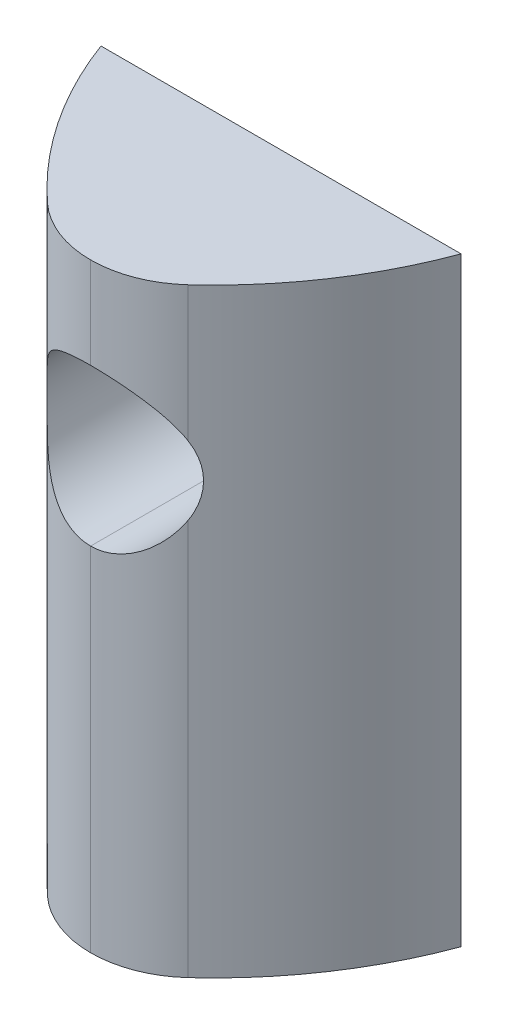
ISO-10303-21;
HEADER;
FILE_DESCRIPTION(('STEP AP214'),'2;1');
FILE_NAME('part.step','',(''),(''),'','','');
FILE_SCHEMA(('AUTOMOTIVE_DESIGN { 1 0 10303 214 1 1 1 1 }'));
ENDSEC;
DATA;
#1=APPLICATION_CONTEXT('core data for automotive mechanical design processes');
#2=APPLICATION_PROTOCOL_DEFINITION('international standard','automotive_design',2000,#1);
#3=PRODUCT_CONTEXT('',#1,'mechanical');
#4=PRODUCT('Part','Part','',(#3));
#5=PRODUCT_RELATED_PRODUCT_CATEGORY('part','',(#4));
#6=PRODUCT_DEFINITION_FORMATION('','',#4);
#7=PRODUCT_DEFINITION_CONTEXT('part definition',#1,'design');
#8=PRODUCT_DEFINITION('design','',#6,#7);
#9=PRODUCT_DEFINITION_SHAPE('','',#8);
#10=(LENGTH_UNIT() NAMED_UNIT(*) SI_UNIT(.MILLI.,.METRE.));
#11=(NAMED_UNIT(*) PLANE_ANGLE_UNIT() SI_UNIT($,.RADIAN.));
#12=(NAMED_UNIT(*) SI_UNIT($,.STERADIAN.) SOLID_ANGLE_UNIT());
#13=UNCERTAINTY_MEASURE_WITH_UNIT(LENGTH_MEASURE(1.E-05),#10,'distance_accuracy_value','');
#14=(GEOMETRIC_REPRESENTATION_CONTEXT(3) GLOBAL_UNCERTAINTY_ASSIGNED_CONTEXT((#13)) GLOBAL_UNIT_ASSIGNED_CONTEXT((#10,
#11,#12)) REPRESENTATION_CONTEXT('',''));
#15=CARTESIAN_POINT('',(0.,0.,0.));
#16=DIRECTION('',(0.,0.,1.));
#17=DIRECTION('',(1.,0.,0.));
#18=AXIS2_PLACEMENT_3D('',#15,#16,#17);
#19=CARTESIAN_POINT('',(0.,0.,3.7));
#20=DIRECTION('',(0.,0.,-1.));
#21=DIRECTION('',(0.,1.,0.));
#22=AXIS2_PLACEMENT_3D('',#19,#20,#21);
#23=CYLINDRICAL_SURFACE('',#22,3.);
#24=DIRECTION('',(0.,0.,1.));
#25=VECTOR('',#24,1.);
#26=CARTESIAN_POINT('',(0.,3.,3.7));
#27=LINE('',#26,#25);
#28=CARTESIAN_POINT('',(0.,3.,0.));
#29=VERTEX_POINT('',#28);
#30=CARTESIAN_POINT('',(0.,3.,7.29999999870545));
#31=VERTEX_POINT('',#30);
#32=EDGE_CURVE('E11',#29,#31,#27,.T.);
#33=ORIENTED_EDGE('',*,*,#32,.F.);
#34=CARTESIAN_POINT('',(0.,0.,-2.10524930821521E-11));
#35=DIRECTION('',(-3.05108595396026E-12,0.,1.));
#36=DIRECTION('',(0.,1.,0.));
#37=AXIS2_PLACEMENT_3D('',#34,#35,#36);
#38=CIRCLE('',#37,3.);
#39=CARTESIAN_POINT('',(0.,-3.,-2.10519420093098E-11));
#40=VERTEX_POINT('',#39);
#41=EDGE_CURVE('E42',#40,#29,#38,.T.);
#42=ORIENTED_EDGE('',*,*,#41,.F.);
#43=DIRECTION('',(0.,0.,-1.));
#44=VECTOR('',#43,1.);
#45=CARTESIAN_POINT('',(0.,-3.,3.7));
#46=LINE('',#45,#44);
#47=CARTESIAN_POINT('',(0.,-3.,7.29999999870545));
#48=VERTEX_POINT('',#47);
#49=EDGE_CURVE('E30',#48,#40,#46,.T.);
#50=ORIENTED_EDGE('',*,*,#49,.F.);
#51=CARTESIAN_POINT('',(2.69192007274975,-1.3242115114795,6.25864264698223));
#52=CARTESIAN_POINT('',(2.67720784347117,-1.35411814201266,6.27202872146754));
#53=CARTESIAN_POINT('',(2.66204738401228,-1.38371102472413,6.2856217327122));
#54=CARTESIAN_POINT('',(2.63072995354465,-1.4424524896421,6.31325383137786));
#55=CARTESIAN_POINT('',(2.61456696080966,-1.47159673937573,6.32729530584371));
#56=CARTESIAN_POINT('',(2.58121584383853,-1.52944089722613,6.35578294758398));
#57=CARTESIAN_POINT('',(2.56402083838565,-1.55813571784571,6.37023138531682));
#58=CARTESIAN_POINT('',(2.52857750693921,-1.61508197796633,6.39948838888067));
#59=CARTESIAN_POINT('',(2.51032147940027,-1.64332758694842,6.41429897049374));
#60=CARTESIAN_POINT('',(2.47272760723834,-1.69937608156812,6.44423295088127));
#61=CARTESIAN_POINT('',(2.45338128004321,-1.72717240608493,6.45935797792016));
#62=CARTESIAN_POINT('',(2.41357854042755,-1.78232314634219,6.48987048938291));
#63=CARTESIAN_POINT('',(2.39311291301674,-1.80967029581839,6.50525908310341));
#64=CARTESIAN_POINT('',(2.35104331285052,-1.86392307093589,6.53624553490519));
#65=CARTESIAN_POINT('',(2.32942944271734,-1.89082075262991,6.55184385981726));
#66=CARTESIAN_POINT('',(2.28503673569903,-1.94417640487641,6.58319263156358));
#67=CARTESIAN_POINT('',(2.26224738982099,-1.97062580846311,6.59894277406409));
#68=CARTESIAN_POINT('',(2.21665326612155,-2.02175832423984,6.62974110956908));
#69=CARTESIAN_POINT('',(2.19388315521676,-2.04647018860848,6.64479289710127));
#70=CARTESIAN_POINT('',(2.14759859995315,-2.09504694182213,6.6746963802095));
#71=CARTESIAN_POINT('',(2.12408815404397,-2.11891526370066,6.68954868354567));
#72=CARTESIAN_POINT('',(2.07631756229429,-2.16580635842281,6.71901884499676));
#73=CARTESIAN_POINT('',(2.05206080485596,-2.18883214093944,6.73363740490861));
#74=CARTESIAN_POINT('',(2.00279206668965,-2.23403831623137,6.7626056417903));
#75=CARTESIAN_POINT('',(1.97778285542022,-2.25622125793177,6.77695604933474));
#76=CARTESIAN_POINT('',(1.92700504877662,-2.29974227738643,6.80535240766267));
#77=CARTESIAN_POINT('',(1.90123859640987,-2.32108240145828,6.81939905290779));
#78=CARTESIAN_POINT('',(1.84894327614461,-2.36291835724841,6.84715144116665));
#79=CARTESIAN_POINT('',(1.822415926535,-2.38341569536674,6.86085777337675));
#80=CARTESIAN_POINT('',(1.76859674023019,-2.42356634157081,6.88789232629755));
#81=CARTESIAN_POINT('',(1.74130580744956,-2.44322058320613,6.90122095936972));
#82=CARTESIAN_POINT('',(1.68595966251818,-2.48168670373533,6.9274615870955));
#83=CARTESIAN_POINT('',(1.65790475769919,-2.50049891354092,6.94037374485316));
#84=CARTESIAN_POINT('',(1.59929539626329,-2.53839820200053,6.96651689145242));
#85=CARTESIAN_POINT('',(1.56869313808505,-2.55743144111336,6.97971890565638));
#86=CARTESIAN_POINT('',(1.50695487761382,-2.59430206778622,7.00542763013001));
#87=CARTESIAN_POINT('',(1.47582717284138,-2.61214943897421,7.01793993535377));
#88=CARTESIAN_POINT('',(1.4130531431408,-2.64665016409749,7.042245757588));
#89=CARTESIAN_POINT('',(1.38141411310399,-2.6633129038567,7.05404477841465));
#90=CARTESIAN_POINT('',(1.31763277696531,-2.69544464378142,7.07690110657756));
#91=CARTESIAN_POINT('',(1.28549675970014,-2.71092234328351,7.08796372110337));
#92=CARTESIAN_POINT('',(1.22073792899109,-2.74068478710282,7.10932445999845));
#93=CARTESIAN_POINT('',(1.18812040331353,-2.75497743703643,7.11962758924341));
#94=CARTESIAN_POINT('',(1.12241598258701,-2.78237069721538,7.13944687285696));
#95=CARTESIAN_POINT('',(1.08933339906701,-2.79547831866537,7.14896762079916));
#96=CARTESIAN_POINT('',(1.02271705299583,-2.82050203423022,7.1672000083506));
#97=CARTESIAN_POINT('',(0.989186670396409,-2.83242415292945,7.17591572105779));
#98=CARTESIAN_POINT('',(0.921694541300396,-2.85507943439018,7.19251610111971));
#99=CARTESIAN_POINT('',(0.887735302499064,-2.86581753868522,7.20040421523846));
#100=CARTESIAN_POINT('',(0.818837424648658,-2.88626818737322,7.21545208465926));
#101=CARTESIAN_POINT('',(0.783891770073834,-2.89596525059668,7.22260079913224));
#102=CARTESIAN_POINT('',(0.713767155292945,-2.91405642675939,7.23596254092414));
#103=CARTESIAN_POINT('',(0.678591727130362,-2.92245948226957,7.24218198043198));
#104=CARTESIAN_POINT('',(0.608033524978298,-2.93796547184082,7.25367740705112));
#105=CARTESIAN_POINT('',(0.572653331877364,-2.94507603750542,7.25895892760568));
#106=CARTESIAN_POINT('',(0.50171126452963,-2.95799796945709,7.26857162758206));
#107=CARTESIAN_POINT('',(0.466151141868007,-2.96381555866894,7.27290735701724));
#108=CARTESIAN_POINT('',(0.39487519883373,-2.97415307178424,7.28062227559394));
#109=CARTESIAN_POINT('',(0.359160439642374,-2.97867771225755,7.28400494078442));
#110=CARTESIAN_POINT('',(0.287601327761551,-2.98643093702231,7.28980839923261));
#111=CARTESIAN_POINT('',(0.251757503934948,-2.98966265685079,7.29223151939141));
#112=CARTESIAN_POINT('',(0.179966449669252,-2.99483127535609,7.29611088622426));
#113=CARTESIAN_POINT('',(0.144019388171461,-2.99676967690429,7.29756825511437));
#114=CARTESIAN_POINT('',(0.0720482708555974,-2.99935471704482,7.29951338294089));
#115=CARTESIAN_POINT('',(0.0360242061418717,-3.00000119730495,7.30000102303156));
#116=CARTESIAN_POINT('',(1.32411364248814E-11,-3.,7.29999999870546));
#117=B_SPLINE_CURVE_WITH_KNOTS('',3,(#51,#52,#53,#54,#55,#56,#57,#58,#59,#60,#61,#62,#63,#64,
#65,#66,#67,#68,#69,#70,#71,#72,#73,#74,#75,#76,#77,#78,#79,#80,#81,#82,#83,#84,#85,#86,#87,#88,
#89,#90,#91,#92,#93,#94,#95,#96,#97,#98,#99,#100,#101,#102,#103,#104,#105,#106,#107,#108,#109,
#110,#111,#112,#113,#114,#115,#116),.UNSPECIFIED.,.F.,.F.,(4,2,2,2,2,2,2,2,2,2,2,2,2,2,2,2,2,2,
2,2,2,2,2,2,2,2,2,2,2,2,2,2,4),(0.,0.107746032995566,0.216217450337496,0.32551656349466,
0.435743378021583,0.546995396535927,0.659367451802861,0.772951569937411,0.887836863083225,
0.998280079306827,1.10820454771261,1.2176877439571,1.32680808343825,1.43564476567889,
1.5442776104283,1.65278688708157,1.76125313918145,1.87636829505888,1.99034238448352,
2.10327954469567,2.2152868051699,2.32647388078152,2.43695292995169,2.54683827912412,
2.65624611591389,2.76710421549757,2.87715803272218,2.98653927727008,3.09538210047251,
3.20382265191496,3.3119986000837,3.42004862487691,3.52811189099413),.UNSPECIFIED.);
#118=CARTESIAN_POINT('',(2.69192396008196,-1.32421501016136,6.25863911008959));
#119=VERTEX_POINT('',#118);
#120=EDGE_CURVE('E136',#119,#48,#117,.T.);
#121=ORIENTED_EDGE('',*,*,#120,.F.);
#122=CARTESIAN_POINT('',(2.69185728044747,1.3241549490095,6.25870011171368));
#123=CARTESIAN_POINT('',(2.70443470825341,1.29850610866361,6.24719381640744));
#124=CARTESIAN_POINT('',(2.71670328909421,1.27259407001275,6.23593303728926));
#125=CARTESIAN_POINT('',(2.74043171805568,1.22059860978277,6.21408885536098));
#126=CARTESIAN_POINT('',(2.75190015162282,1.19452205026827,6.20349843576422));
#127=CARTESIAN_POINT('',(2.77403481822859,1.14219740381921,6.18300154664542));
#128=CARTESIAN_POINT('',(2.7847092560312,1.11595548639828,6.17308820755108));
#129=CARTESIAN_POINT('',(2.80526202490549,1.06330106130273,6.15395168362618));
#130=CARTESIAN_POINT('',(2.81514810277422,1.03689399050042,6.144721870321));
#131=CARTESIAN_POINT('',(2.83413003362655,0.983909969453827,6.12695791954373));
#132=CARTESIAN_POINT('',(2.84323309233468,0.957337712213903,6.11841749652379));
#133=CARTESIAN_POINT('',(2.86065432787739,0.904024020516801,6.1020375001179));
#134=CARTESIAN_POINT('',(2.86897908834832,0.877286535257312,6.09419208449227));
#135=CARTESIAN_POINT('',(2.88484958160838,0.82364340897977,6.07920592203263));
#136=CARTESIAN_POINT('',(2.89240118633839,0.796740986061545,6.0720598852911));
#137=CARTESIAN_POINT('',(2.90672787815533,0.742767732942254,6.05847861575652));
#138=CARTESIAN_POINT('',(2.9135080692256,0.71569943111102,6.05203872253978));
#139=CARTESIAN_POINT('',(2.92658668060808,0.660204764319864,6.03959699759912));
#140=CARTESIAN_POINT('',(2.93285694367211,0.631765921292732,6.03362116663946));
#141=CARTESIAN_POINT('',(2.94454939656982,0.574813532259298,6.02246189014066));
#142=CARTESIAN_POINT('',(2.94997815645342,0.546302538328794,6.01727231395095));
#143=CARTESIAN_POINT('',(2.95998951162952,0.489205510366902,6.00769053163653));
#144=CARTESIAN_POINT('',(2.96457764061418,0.460621323462035,6.00329311437882));
#145=CARTESIAN_POINT('',(2.97291231342435,0.403378918774342,5.99529703386324));
#146=CARTESIAN_POINT('',(2.97666324175023,0.374721921612543,5.99169421047989));
#147=CARTESIAN_POINT('',(2.98332683118071,0.317334433688192,5.98528884682715));
#148=CARTESIAN_POINT('',(2.98624265802846,0.288604648469963,5.98248328458559));
#149=CARTESIAN_POINT('',(2.99123921278662,0.231072110382954,5.97767306141957));
#150=CARTESIAN_POINT('',(2.99332182969163,0.202269673260767,5.97566658890309));
#151=CARTESIAN_POINT('',(2.99665431399511,0.144592185220519,5.97245489855647));
#152=CARTESIAN_POINT('',(2.99790475802235,0.115717198528522,5.9712491259071));
#153=CARTESIAN_POINT('',(2.99957587367158,0.0578948851457967,5.96963753354035));
#154=CARTESIAN_POINT('',(2.99999579580762,0.0289475166968562,5.96923243637493));
#155=CARTESIAN_POINT('',(3.00000419827837,-0.0289067957285459,5.96922433162744));
#156=CARTESIAN_POINT('',(2.99959384738556,-0.0578137392882151,5.96962019653383));
#157=CARTESIAN_POINT('',(2.9979383546292,-0.115566754520504,5.97121672935865));
#158=CARTESIAN_POINT('',(2.99669363883272,-0.14441284972724,5.97241698651544));
#159=CARTESIAN_POINT('',(2.99337084174549,-0.202044144277529,5.97561936570399));
#160=CARTESIAN_POINT('',(2.99129184821313,-0.230829242173793,5.97762236549219));
#161=CARTESIAN_POINT('',(2.98630031777555,-0.288338706386949,5.98242779799937));
#162=CARTESIAN_POINT('',(2.98338554941799,-0.317062699925251,5.98523237078872));
#163=CARTESIAN_POINT('',(2.97672196888944,-0.374450226312713,5.99163779188604));
#164=CARTESIAN_POINT('',(2.97296964787172,-0.403112977037091,5.99524198975087));
#165=CARTESIAN_POINT('',(2.96463007599875,-0.460378545664483,6.00324284770712));
#166=CARTESIAN_POINT('',(2.96003810187994,-0.488980048319184,6.00764398937762));
#167=CARTESIAN_POINT('',(2.9500167967348,-0.546123322386889,6.01723536852602));
#168=CARTESIAN_POINT('',(2.94458160103624,-0.574663135648629,6.02243112873598));
#169=CARTESIAN_POINT('',(2.9328745124041,-0.631685020839555,6.03360442462066));
#170=CARTESIAN_POINT('',(2.92659573688647,-0.660164419241611,6.03958838217691));
#171=CARTESIAN_POINT('',(2.91350930280786,-0.715696041465436,6.05203754917862));
#172=CARTESIAN_POINT('',(2.90673096637712,-0.742761257281122,6.05847568319203));
#173=CARTESIAN_POINT('',(2.89240717707849,-0.79672909275676,6.07205421130372));
#174=CARTESIAN_POINT('',(2.88485658923339,-0.823629168983709,6.07919929435083));
#175=CARTESIAN_POINT('',(2.86898782345944,-0.877268585866095,6.09418384672839));
#176=CARTESIAN_POINT('',(2.86066374668881,-0.904004693689498,6.10202863027382));
#177=CARTESIAN_POINT('',(2.84324343351112,-0.957316554109948,6.11840778751711));
#178=CARTESIAN_POINT('',(2.83414058594699,-0.983888341061818,6.12694802800006));
#179=CARTESIAN_POINT('',(2.81515866574842,-1.0368723629722,6.14471200159126));
#180=CARTESIAN_POINT('',(2.80527236110165,-1.06327988774955,6.15394204324487));
#181=CARTESIAN_POINT('',(2.7847187125932,-1.11593615851593,6.17307941922457));
#182=CARTESIAN_POINT('',(2.77404359661872,-1.14217944980414,6.18299340370796));
#183=CARTESIAN_POINT('',(2.75190714597882,-1.19450778342918,6.20349197316605));
#184=CARTESIAN_POINT('',(2.74043758252974,-1.22058663812563,6.2140834477621));
#185=CARTESIAN_POINT('',(2.71670645754648,-1.27258762826885,6.23593012938246));
#186=CARTESIAN_POINT('',(2.70443628787282,-1.29850288353682,6.24719237158367));
#187=CARTESIAN_POINT('',(2.69185728044747,-1.3241549490095,6.25870011171368));
#188=B_SPLINE_CURVE_WITH_KNOTS('',3,(#122,#123,#124,#125,#126,#127,#128,#129,#130,#131,#132,
#133,#134,#135,#136,#137,#138,#139,#140,#141,#142,#143,#144,#145,#146,#147,#148,#149,#150,#151,
#152,#153,#154,#155,#156,#157,#158,#159,#160,#161,#162,#163,#164,#165,#166,#167,#168,#169,#170,
#171,#172,#173,#174,#175,#176,#177,#178,#179,#180,#181,#182,#183,#184,#185,#186,#187),
.UNSPECIFIED.,.F.,.F.,(4,2,2,2,2,2,2,2,2,2,2,2,2,2,2,2,2,2,2,2,2,2,2,2,2,2,2,2,2,2,2,2,4),(0.,
0.0923890257677431,0.183549375057859,0.273575659479655,0.362566107873962,0.450622415703839,
0.537849545805302,0.624355479389707,0.710250917657231,0.799415494568442,0.887844437908147,
0.975668537110993,1.06302129851166,1.15003839795981,1.23685708501175,1.32361555089749,
1.4104522743668,1.49716684312761,1.58383716493545,1.67060251583722,1.75760171547498,
1.84497246882182,1.93285073417186,2.02137013133183,2.11066140185422,2.19654559289626,
2.28304342280322,2.37026565554613,2.45832032141485,2.54731241915286,2.6373436676781,
2.72851230770726,2.82091295213283),.UNSPECIFIED.);
#189=CARTESIAN_POINT('',(2.69192396008196,1.32421501016136,6.25863911008959));
#190=VERTEX_POINT('',#189);
#191=EDGE_CURVE('E85',#190,#119,#188,.T.);
#192=ORIENTED_EDGE('',*,*,#191,.F.);
#193=CARTESIAN_POINT('',(1.32411364248814E-11,3.,7.29999999870546));
#194=CARTESIAN_POINT('',(0.0360207335113398,3.00000119726179,7.30000102279163));
#195=CARTESIAN_POINT('',(0.0720413214936223,2.99935469917077,7.29951347677356));
#196=CARTESIAN_POINT('',(0.14400648748177,2.99676965905001,7.29756869756388));
#197=CARTESIAN_POINT('',(0.179951072376144,2.99483123963293,7.29611155639387));
#198=CARTESIAN_POINT('',(0.251738177232777,2.98966262103131,7.29223272470486));
#199=CARTESIAN_POINT('',(0.287580524248409,2.98643088334057,7.28980988542408));
#200=CARTESIAN_POINT('',(0.359137687034473,2.97867765928801,7.28400698735207));
#201=CARTESIAN_POINT('',(0.394851968027614,2.97415300234639,7.28062457558389));
#202=CARTESIAN_POINT('',(0.466127953237868,2.96381548786136,7.2729100821421));
#203=CARTESIAN_POINT('',(0.5016885885866,2.95799787970023,7.26857449893564));
#204=CARTESIAN_POINT('',(0.572632675197733,2.94507595569465,7.25896192872977));
#205=CARTESIAN_POINT('',(0.608014365634782,2.93796538435148,7.25368036693103));
#206=CARTESIAN_POINT('',(0.678576526645043,2.92245936964555,7.24218461941482));
#207=CARTESIAN_POINT('',(0.713754405658418,2.91405626351391,7.23596487626818));
#208=CARTESIAN_POINT('',(0.783884929601822,2.89596518913695,7.22260219720795));
#209=CARTESIAN_POINT('',(0.818834031164918,2.88626825068588,7.21545282585277));
#210=CARTESIAN_POINT('',(0.887728804602542,2.86582039876961,7.20040563440502));
#211=CARTESIAN_POINT('',(0.921681644669748,2.85508530522341,7.1925190954071));
#212=CARTESIAN_POINT('',(0.989162868826997,2.83243510858648,7.17592175375265));
#213=CARTESIAN_POINT('',(1.02268871262736,2.82051499826391,7.16720746101109));
#214=CARTESIAN_POINT('',(1.08929791116863,2.79549457903145,7.14897763881727));
#215=CARTESIAN_POINT('',(1.12237785069639,2.7823881819015,7.1394579946058));
#216=CARTESIAN_POINT('',(1.18807886421819,2.75499659103324,7.11964050168788));
#217=CARTESIAN_POINT('',(1.22069558881394,2.74070432392682,7.10933801961493));
#218=CARTESIAN_POINT('',(1.28545466061118,2.71094187637099,7.08797801631338));
#219=CARTESIAN_POINT('',(1.31759168011971,2.69546373054639,7.07691545234385));
#220=CARTESIAN_POINT('',(1.38137682353243,2.66333033626995,7.05405852548941));
#221=CARTESIAN_POINT('',(1.41301861712991,2.64666633160052,7.04225881947138));
#222=CARTESIAN_POINT('',(1.47579989417758,2.61216225839393,7.01795080648098));
#223=CARTESIAN_POINT('',(1.506932039896,2.59431274984459,7.00543696177486));
#224=CARTESIAN_POINT('',(1.56868095331548,2.55743723359805,6.97972415959513));
#225=CARTESIAN_POINT('',(1.59928938107217,2.53840119349278,6.96651957460433));
#226=CARTESIAN_POINT('',(1.65789941582652,2.5005032138002,6.94037612760678));
#227=CARTESIAN_POINT('',(1.68594913466551,2.4816954651015,6.92746643043222));
#228=CARTESIAN_POINT('',(1.74128646274335,2.44323691254236,6.90123027914888));
#229=CARTESIAN_POINT('',(1.76857372059562,2.42358573022331,6.88790363869531));
#230=CARTESIAN_POINT('',(1.82238717480688,2.38344004514625,6.86087246692367));
#231=CARTESIAN_POINT('',(1.84891242190192,2.36294456188418,6.84716750270983));
#232=CARTESIAN_POINT('',(1.9012050783957,2.32111110544903,6.81941715302714));
#233=CARTESIAN_POINT('',(1.92697092314437,2.29977157975769,6.80537116051916));
#234=CARTESIAN_POINT('',(1.97774901040719,2.25625055740393,6.77697530798268));
#235=CARTESIAN_POINT('',(2.00275906291921,2.23406696954453,6.7626247382502));
#236=CARTESIAN_POINT('',(2.05203093048996,2.18885830629323,6.73365527917095));
#237=CARTESIAN_POINT('',(2.07628992881479,2.16583063862539,6.71903564648338));
#238=CARTESIAN_POINT('',(2.1240663675779,2.11893454298565,6.68956237045814));
#239=CARTESIAN_POINT('',(2.14758037230112,2.09506306363994,6.6747080149487));
#240=CARTESIAN_POINT('',(2.19387345087504,2.04647889169437,6.64479930925103));
#241=CARTESIAN_POINT('',(2.21664847975151,2.02176272687648,6.62974434280434));
#242=CARTESIAN_POINT('',(2.26224580975798,1.97062858413565,6.59894384128145));
#243=CARTESIAN_POINT('',(2.28503369111879,1.94418205958111,6.58319473399072));
#244=CARTESIAN_POINT('',(2.32942387917096,1.89083127292589,6.55184783564178));
#245=CARTESIAN_POINT('',(2.35103667486423,1.86393556303823,6.53625034626084));
#246=CARTESIAN_POINT('',(2.39310462249741,1.80968597483469,6.50526526651381));
#247=CARTESIAN_POINT('',(2.41356964985496,1.7823400234703,6.48987720945928));
#248=CARTESIAN_POINT('',(2.45337163984553,1.72719088790597,6.45936546241577));
#249=CARTESIAN_POINT('',(2.47271779508886,1.69939495279017,6.44424066510961));
#250=CARTESIAN_POINT('',(2.51031176328465,1.6433464553404,6.41430680461732));
#251=CARTESIAN_POINT('',(2.52856803573848,1.61510043647342,6.39949611723449));
#252=CARTESIAN_POINT('',(2.56401227796904,1.55815257275552,6.37023854052311));
#253=CARTESIAN_POINT('',(2.58120792573355,1.52945654061254,6.3557896414804));
#254=CARTESIAN_POINT('',(2.61456073223417,1.47160917687133,6.32730069510672));
#255=CARTESIAN_POINT('',(2.630724748251,1.44246291497454,6.31325838533186));
#256=CARTESIAN_POINT('',(2.66204461569933,1.38371664189106,6.2856242138113));
#257=CARTESIAN_POINT('',(2.67720646470949,1.35412094565209,6.27202997488128));
#258=CARTESIAN_POINT('',(2.69192007274975,1.3242115114795,6.25864264698223));
#259=B_SPLINE_CURVE_WITH_KNOTS('',3,(#193,#194,#195,#196,#197,#198,#199,#200,#201,#202,#203,
#204,#205,#206,#207,#208,#209,#210,#211,#212,#213,#214,#215,#216,#217,#218,#219,#220,#221,#222,
#223,#224,#225,#226,#227,#228,#229,#230,#231,#232,#233,#234,#235,#236,#237,#238,#239,#240,#241,
#242,#243,#244,#245,#246,#247,#248,#249,#250,#251,#252,#253,#254,#255,#256,#257,#258),
.UNSPECIFIED.,.F.,.F.,(4,2,2,2,2,2,2,2,2,2,2,2,2,2,2,2,2,2,2,2,2,2,2,2,2,2,2,2,2,2,2,2,4),(0.,
0.108052842411248,0.216095431288337,0.324266929393859,0.432706003193752,0.541550296493246,
0.650935923402379,0.760996989624422,0.871865149863504,0.981251435185395,1.09112134042492,
1.20159110325959,1.31277508002916,1.4247854395926,1.53773188877079,1.65172143167315,
1.76685816421485,1.87530274798378,1.98379651152266,2.09242003390032,2.20125360615662,
2.31037705586252,2.41986957674799,2.52980956515522,2.64027446490576,2.75514989964334,
2.86872693483271,2.98109471841683,3.09234530675708,3.20257355662904,3.31187698776845,
3.42035561534444,3.52811175239044),.UNSPECIFIED.);
#260=EDGE_CURVE('E93',#31,#190,#259,.T.);
#261=ORIENTED_EDGE('',*,*,#260,.F.);
#262=EDGE_LOOP('',(#33,#42,#50,#121,#192,#261));
#263=FACE_BOUND('',#262,.T.);
#264=ADVANCED_FACE('F16',(#263),#23,.F.);
#265=CARTESIAN_POINT('',(0.,0.,3.7));
#266=DIRECTION('',(0.,0.,-1.));
#267=DIRECTION('',(0.,1.,0.));
#268=AXIS2_PLACEMENT_3D('',#265,#266,#267);
#269=CYLINDRICAL_SURFACE('',#268,3.);
#270=ORIENTED_EDGE('',*,*,#32,.T.);
#271=CARTESIAN_POINT('',(-2.69192007353912,1.3242115098752,6.25864264785003));
#272=CARTESIAN_POINT('',(-2.67720784426977,1.35411814043462,6.27202872234223));
#273=CARTESIAN_POINT('',(-2.66204738481959,1.38371102317227,6.28562173359422));
#274=CARTESIAN_POINT('',(-2.63072995436847,1.44245248814212,6.31325383227512));
#275=CARTESIAN_POINT('',(-2.6145669616413,1.47159673790146,6.32729530674887));
#276=CARTESIAN_POINT('',(-2.58121584468479,1.52944089580282,6.35578294850541));
#277=CARTESIAN_POINT('',(-2.56402083923872,1.55813571644765,6.37023138624662));
#278=CARTESIAN_POINT('',(-2.52857750780479,1.6150819766183,6.39948838982753));
#279=CARTESIAN_POINT('',(-2.51032148027155,1.64332758562518,6.4142989714493));
#280=CARTESIAN_POINT('',(-2.47272760811982,1.69937608029399,6.44423295185441));
#281=CARTESIAN_POINT('',(-2.45338128092917,1.72717240483512,6.45935797890217));
#282=CARTESIAN_POINT('',(-2.41357854132119,1.78232314514057,6.4898704903827));
#283=CARTESIAN_POINT('',(-2.39311291391354,1.80967029464062,6.50525908411211));
#284=CARTESIAN_POINT('',(-2.35104331375228,1.86392306980541,6.53624553593152));
#285=CARTESIAN_POINT('',(-2.32942944362088,1.89082075152286,6.55184386085232));
#286=CARTESIAN_POINT('',(-2.28503673660454,1.94417640381563,6.58319263261583));
#287=CARTESIAN_POINT('',(-2.26224739072666,1.97062580742516,6.5989427751248));
#288=CARTESIAN_POINT('',(-2.21665326702196,2.0217583232514,6.62974111064848));
#289=CARTESIAN_POINT('',(-2.19388315611163,2.04647018764658,6.64479289819093));
#290=CARTESIAN_POINT('',(-2.1475986008374,2.09504694091157,6.67469638131738));
#291=CARTESIAN_POINT('',(-2.1240881549232,2.11891526281494,6.68954868466155));
#292=CARTESIAN_POINT('',(-2.07631756316387,2.16580635758483,6.7190188461264));
#293=CARTESIAN_POINT('',(-2.05206080572099,2.18883214012443,6.73363740604405));
#294=CARTESIAN_POINT('',(-2.00279206754606,2.23403831546042,6.76260564293509));
#295=CARTESIAN_POINT('',(-1.97778285627263,2.25622125718196,6.7769560504831));
#296=CARTESIAN_POINT('',(-1.9270050496216,2.29974227667701,6.80535240881592));
#297=CARTESIAN_POINT('',(-1.90123859725147,2.32108240076816,6.81939905406237));
#298=CARTESIAN_POINT('',(-1.8489432769801,2.36291835659499,6.84715144232162));
#299=CARTESIAN_POINT('',(-1.8224159273678,2.38341569473078,6.86085777453081));
#300=CARTESIAN_POINT('',(-1.76859674105836,2.4235663409679,6.88789232744748));
#301=CARTESIAN_POINT('',(-1.74130580827585,2.44322058261886,6.90122096051647));
#302=CARTESIAN_POINT('',(-1.68595966334144,2.48168670317737,6.92746158823363));
#303=CARTESIAN_POINT('',(-1.65790475852137,2.50049891299667,6.94037374598587));
#304=CARTESIAN_POINT('',(-1.59929539707087,2.53839820149167,6.96651689257754));
#305=CARTESIAN_POINT('',(-1.56869313887872,2.5574314406258,6.97971890677904));
#306=CARTESIAN_POINT('',(-1.50695487837918,2.5943020673399,7.0054276312451));
#307=CARTESIAN_POINT('',(-1.47582717359238,2.61214943854786,7.01793993646379));
#308=CARTESIAN_POINT('',(-1.41305314386265,2.64665016370958,7.04224575868522));
#309=CARTESIAN_POINT('',(-1.38141411381108,2.66331290348731,7.05404477950417));
#310=CARTESIAN_POINT('',(-1.31763277764258,2.69544464344759,7.07690110764895));
#311=CARTESIAN_POINT('',(-1.28549676036239,2.71092234296677,7.08796372216436));
#312=CARTESIAN_POINT('',(-1.2207379296231,2.74068478681879,7.10932446103587));
#313=CARTESIAN_POINT('',(-1.18812040393035,2.75497743676805,7.11962759026769));
#314=CARTESIAN_POINT('',(-1.12241598317341,2.78237069697685,7.13944687385212));
#315=CARTESIAN_POINT('',(-1.08933339963821,2.79547831844106,7.14896762177838));
#316=CARTESIAN_POINT('',(-1.02271705353668,2.82050203403289,7.16720000929506));
#317=CARTESIAN_POINT('',(-0.98918667092215,2.8324241527449,7.17591572198348));
#318=CARTESIAN_POINT('',(-0.921694541796133,2.85507943422975,7.19251610200492));
#319=CARTESIAN_POINT('',(-0.887735302979928,2.86581753853616,7.200404216102));
#320=CARTESIAN_POINT('',(-0.818837425096882,2.88626818724644,7.2154520854768));
#321=CARTESIAN_POINT('',(-0.783891770504249,2.89596525048071,7.22260079992536));
#322=CARTESIAN_POINT('',(-0.713767155686989,2.91405642666361,7.23596254166554));
#323=CARTESIAN_POINT('',(-0.678591727505841,2.92245948218316,7.2421819811461));
#324=CARTESIAN_POINT('',(-0.608033525316031,2.93796547177171,7.25367740770773));
#325=CARTESIAN_POINT('',(-0.572653332195912,2.94507603744422,7.25895892823206));
#326=CARTESIAN_POINT('',(-0.501711264809338,2.95799796941031,7.26857162814497));
#327=CARTESIAN_POINT('',(-0.466151142128055,2.96381555862864,7.27290735754689));
#328=CARTESIAN_POINT('',(-0.394875199054135,2.97415307175547,7.28062227605397));
#329=CARTESIAN_POINT('',(-0.35916043984279,2.97867771223381,7.28400494120807));
#330=CARTESIAN_POINT('',(-0.287601327921822,2.98643093700723,7.28980839958033));
#331=CARTESIAN_POINT('',(-0.251757504075058,2.98966265683929,7.29223151969957));
#332=CARTESIAN_POINT('',(-0.179966449769027,2.99483127535035,7.29611088645003));
#333=CARTESIAN_POINT('',(-0.144019388251058,2.9967696769007,7.29756825529731));
#334=CARTESIAN_POINT('',(-0.072048270894988,2.99935471704412,7.29951338303485));
#335=CARTESIAN_POINT('',(-0.0360242061612325,3.00000119730496,7.30000102307937));
#336=CARTESIAN_POINT('',(-1.32235033295641E-11,3.,7.29999999870545));
#337=B_SPLINE_CURVE_WITH_KNOTS('',3,(#271,#272,#273,#274,#275,#276,#277,#278,#279,#280,#281,
#282,#283,#284,#285,#286,#287,#288,#289,#290,#291,#292,#293,#294,#295,#296,#297,#298,#299,#300,
#301,#302,#303,#304,#305,#306,#307,#308,#309,#310,#311,#312,#313,#314,#315,#316,#317,#318,#319,
#320,#321,#322,#323,#324,#325,#326,#327,#328,#329,#330,#331,#332,#333,#334,#335,#336),
.UNSPECIFIED.,.F.,.F.,(4,2,2,2,2,2,2,2,2,2,2,2,2,2,2,2,2,2,2,2,2,2,2,2,2,2,2,2,2,2,2,2,4),(0.,
0.107746033057521,0.216217450460323,0.32551656367742,0.435743378263482,0.546995396836317,
0.659367452161237,0.772951570353409,0.887836863556622,0.998280079856501,1.10820454833017,
1.21768774463415,1.32680808416641,1.43564476644981,1.54427761123368,1.65278688791317,
1.76125314003112,1.87636829597089,1.99034238545389,2.1032795457205,2.21528680624545,
2.32647388190421,2.4369529311181,2.546838280331,2.6562461171582,2.76710421678661,
2.87715803405706,2.98653927865218,3.09538210190347,3.20382265339672,3.31199860161843,
3.42004862646707,3.5281118926424),.UNSPECIFIED.);
#338=CARTESIAN_POINT('',(-2.6919239608712,1.32421500855696,6.25863911095751));
#339=VERTEX_POINT('',#338);
#340=EDGE_CURVE('E188',#339,#31,#337,.T.);
#341=ORIENTED_EDGE('',*,*,#340,.F.);
#342=CARTESIAN_POINT('',(-2.69185728123629,-1.3241549474047,6.25870011258205));
#343=CARTESIAN_POINT('',(-2.70443470901148,-1.2985061070828,6.24719381729227));
#344=CARTESIAN_POINT('',(-2.71670328982225,-1.27259406845666,6.23593303819037));
#345=CARTESIAN_POINT('',(-2.74043171872542,-1.22059860827741,6.21408885629408));
#346=CARTESIAN_POINT('',(-2.75190015226429,-1.19452204878891,6.20349843671304));
#347=CARTESIAN_POINT('',(-2.77403481881529,-1.14219740239316,6.18300154762504));
#348=CARTESIAN_POINT('',(-2.78470925659139,-1.11595548499954,6.17308820854579));
#349=CARTESIAN_POINT('',(-2.80526202541439,-1.06330105995989,6.15395168465043));
#350=CARTESIAN_POINT('',(-2.81514810325833,-1.03689398918617,6.1447218713597));
#351=CARTESIAN_POINT('',(-2.83413003406278,-0.983909968198057,6.12695792061065));
#352=CARTESIAN_POINT('',(-2.8432330927478,-0.957337710988015,6.11841749760447));
#353=CARTESIAN_POINT('',(-2.860654328246,-0.904024019351972,6.10203750122541));
#354=CARTESIAN_POINT('',(-2.86897908869551,-0.877286534123656,6.09419208561284));
#355=CARTESIAN_POINT('',(-2.88484958191442,-0.823643407909761,6.07920592317856));
#356=CARTESIAN_POINT('',(-2.89240118662468,-0.796740985024008,6.07205988644933));
#357=CARTESIAN_POINT('',(-2.90672787840369,-0.742767731970926,6.05847861693865));
#358=CARTESIAN_POINT('',(-2.91350806945579,-0.715699430173429,6.05203872373351));
#359=CARTESIAN_POINT('',(-2.92658668080327,-0.660204763451256,6.03959699881525));
#360=CARTESIAN_POINT('',(-2.93285694385054,-0.631765920459398,6.03362116786639));
#361=CARTESIAN_POINT('',(-2.94454939671706,-0.574813531497212,6.02246189138774));
#362=CARTESIAN_POINT('',(-2.94997815658621,-0.546302537602675,6.0172723152074));
#363=CARTESIAN_POINT('',(-2.95998951173567,-0.489205509713397,6.00769053291033));
#364=CARTESIAN_POINT('',(-2.96457764070812,-0.460621322845172,6.00329311566059));
#365=CARTESIAN_POINT('',(-2.97291231349613,-0.403378918231451,5.99529703515953));
#366=CARTESIAN_POINT('',(-2.97666324181206,-0.374721921106979,5.99169421178272));
#367=CARTESIAN_POINT('',(-2.98332683122485,-0.317334433257957,5.98528884814164));
#368=CARTESIAN_POINT('',(-2.98624265806485,-0.28860464807773,5.98248328590519));
#369=CARTESIAN_POINT('',(-2.99123921280978,-0.231072110067405,5.97767306274793));
#370=CARTESIAN_POINT('',(-2.99332182970928,-0.2022696729839,5.97566659023509));
#371=CARTESIAN_POINT('',(-2.99665431400393,-0.144592185021691,5.97245489989433));
#372=CARTESIAN_POINT('',(-2.99790475802785,-0.11571719836905,5.97124912724717));
#373=CARTESIAN_POINT('',(-2.99957587367266,-0.0578948850657166,5.96963753488336));
#374=CARTESIAN_POINT('',(-2.99999579580761,-0.0289475166568128,5.96923243771865));
#375=CARTESIAN_POINT('',(-3.00000419827837,0.0289067956884737,5.96922433297115));
#376=CARTESIAN_POINT('',(-2.99959384738664,0.057813739208064,5.96962019787682));
#377=CARTESIAN_POINT('',(-2.99793835463469,0.115566754360885,5.97121673069871));
#378=CARTESIAN_POINT('',(-2.9966936388415,0.144412849528232,5.9724169878533));
#379=CARTESIAN_POINT('',(-2.99337084176309,0.202044144000432,5.975619367036));
#380=CARTESIAN_POINT('',(-2.99129184823624,0.230829241857996,5.97762236682055));
#381=CARTESIAN_POINT('',(-2.9863003178119,0.288338705994441,5.98242779931897));
#382=CARTESIAN_POINT('',(-2.98338554946207,0.317062699494732,5.98523237210322));
#383=CARTESIAN_POINT('',(-2.9767219689512,0.374450225806865,5.99163779318888));
#384=CARTESIAN_POINT('',(-2.97296964794345,0.403112976493925,5.99524199104717));
#385=CARTESIAN_POINT('',(-2.96463007609265,0.460378545047371,6.0032428489889));
#386=CARTESIAN_POINT('',(-2.96003810198606,0.48898004766545,6.00764399065141));
#387=CARTESIAN_POINT('',(-2.95001679686757,0.546123321660585,6.01723536978247));
#388=CARTESIAN_POINT('',(-2.94458160118346,0.574663134886386,6.02243112998306));
#389=CARTESIAN_POINT('',(-2.93287451258253,0.631685020006138,6.03360442584758));
#390=CARTESIAN_POINT('',(-2.92659573708168,0.66016441837297,6.03958838339304));
#391=CARTESIAN_POINT('',(-2.91350930303803,0.715696040527853,6.05203755037236));
#392=CARTESIAN_POINT('',(-2.90673096662544,0.742761256309791,6.0584756843742));
#393=CARTESIAN_POINT('',(-2.8924071773647,0.796729091719211,6.07205421246201));
#394=CARTESIAN_POINT('',(-2.88485658953936,0.82362916791369,6.07919929549681));
#395=CARTESIAN_POINT('',(-2.86898782380658,0.877268584732428,6.09418384784901));
#396=CARTESIAN_POINT('',(-2.86066374705736,0.904004692524656,6.10202863138138));
#397=CARTESIAN_POINT('',(-2.84324343392417,0.957316552884042,6.11840778859785));
#398=CARTESIAN_POINT('',(-2.83414058638314,0.983888339806028,6.12694802906704));
#399=CARTESIAN_POINT('',(-2.81515866623245,1.03687236165793,6.14471200263002));
#400=CARTESIAN_POINT('',(-2.80527236161048,1.0632798864067,6.15394204426917));
#401=CARTESIAN_POINT('',(-2.78471871315334,1.11593615711718,6.17307942021933));
#402=CARTESIAN_POINT('',(-2.77404359720536,1.14217944837809,6.18299340468762));
#403=CARTESIAN_POINT('',(-2.75190714662024,1.19450778194981,6.20349197411491));
#404=CARTESIAN_POINT('',(-2.74043758319944,1.22058663662026,6.21408344869524));
#405=CARTESIAN_POINT('',(-2.71670645827448,1.27258762671275,6.2359301302836));
#406=CARTESIAN_POINT('',(-2.70443628863087,1.298502881956,6.24719237246852));
#407=CARTESIAN_POINT('',(-2.69185728123629,1.3241549474047,6.25870011258205));
#408=B_SPLINE_CURVE_WITH_KNOTS('',3,(#342,#343,#344,#345,#346,#347,#348,#349,#350,#351,#352,
#353,#354,#355,#356,#357,#358,#359,#360,#361,#362,#363,#364,#365,#366,#367,#368,#369,#370,#371,
#372,#373,#374,#375,#376,#377,#378,#379,#380,#381,#382,#383,#384,#385,#386,#387,#388,#389,#390,
#391,#392,#393,#394,#395,#396,#397,#398,#399,#400,#401,#402,#403,#404,#405,#406,#407),
.UNSPECIFIED.,.F.,.F.,(4,2,2,2,2,2,2,2,2,2,2,2,2,2,2,2,2,2,2,2,2,2,2,2,2,2,2,2,2,2,2,2,4),(0.,
0.092389025651665,0.18354937482646,0.273575659133462,0.362566107413203,0.450622415128482,
0.537849545115054,0.624355478583985,0.710250916735156,0.799415493528093,0.887844436750603,
0.975668535836882,1.06302129712117,1.15003839645269,1.23685708338729,1.32361554915454,
1.41045227250376,1.49716684114436,1.58383716283362,1.67060251361799,1.7576017131391,
1.84497246636958,1.9328507316031,2.02137012864595,2.11066139905019,2.1965455899759,
2.28304341976738,2.3702656523954,2.45832031814952,2.54731241577297,2.6373436641834,
2.72851230409724,2.82091294840671),.UNSPECIFIED.);
#409=CARTESIAN_POINT('',(-2.6919239608712,-1.32421500855696,6.25863911095751));
#410=VERTEX_POINT('',#409);
#411=EDGE_CURVE('E181',#410,#339,#408,.T.);
#412=ORIENTED_EDGE('',*,*,#411,.F.);
#413=CARTESIAN_POINT('',(-1.32235033295641E-11,-3.,7.29999999870545));
#414=CARTESIAN_POINT('',(-0.0360207335326821,-3.00000119726179,7.30000102283944));
#415=CARTESIAN_POINT('',(-0.0720413215369784,-2.99935469917007,7.29951347686746));
#416=CARTESIAN_POINT('',(-0.144006487568726,-2.99676965904644,7.29756869774655));
#417=CARTESIAN_POINT('',(-0.17995107248469,-2.99483123962722,7.29611155661924));
#418=CARTESIAN_POINT('',(-0.251738177383909,-2.98966262101984,7.2922327250123));
#419=CARTESIAN_POINT('',(-0.287580524420543,-2.98643088332551,7.28980988577093));
#420=CARTESIAN_POINT('',(-0.359137687247859,-2.97867765926431,7.28400698777453));
#421=CARTESIAN_POINT('',(-0.39485196826126,-2.97415300231767,7.28062457604258));
#422=CARTESIAN_POINT('',(-0.466127953511131,-2.9638154878211,7.27291008267017));
#423=CARTESIAN_POINT('',(-0.50168858887923,-2.9579978796535,7.26857449949688));
#424=CARTESIAN_POINT('',(-0.572632675528048,-2.9450759556335,7.25896192935443));
#425=CARTESIAN_POINT('',(-0.608014365983426,-2.93796538428242,7.25368036758594));
#426=CARTESIAN_POINT('',(-0.678576527029168,-2.92245936955921,7.24218462012743));
#427=CARTESIAN_POINT('',(-0.713754406059706,-2.91405626341823,7.23596487700824));
#428=CARTESIAN_POINT('',(-0.783884930036107,-2.89596518902104,7.22260219800028));
#429=CARTESIAN_POINT('',(-0.818834031615046,-2.88626825055909,7.2154528266699));
#430=CARTESIAN_POINT('',(-0.887728805085618,-2.86582039861935,7.20040563526808));
#431=CARTESIAN_POINT('',(-0.921681645169906,-2.85508530506049,7.19251909629128));
#432=CARTESIAN_POINT('',(-0.989162869360929,-2.8324351083973,7.17592175467624));
#433=CARTESIAN_POINT('',(-1.02268871317797,-2.8205149980611,7.16720746195297));
#434=CARTESIAN_POINT('',(-1.08929791175207,-2.79549457880028,7.14897763979302));
#435=CARTESIAN_POINT('',(-1.12237785129595,-2.78238818165559,7.1394579955971));
#436=CARTESIAN_POINT('',(-1.18807886484935,-2.75499659075678,7.11964050270768));
#437=CARTESIAN_POINT('',(-1.22069558946055,-2.74070432363455,7.10933802064766));
#438=CARTESIAN_POINT('',(-1.28545466128795,-2.71094187604602,7.08797801736943));
#439=CARTESIAN_POINT('',(-1.31759168081116,-2.69546373020452,7.07691545341027));
#440=CARTESIAN_POINT('',(-1.38137682425239,-2.66333033589321,7.05405852657418));
#441=CARTESIAN_POINT('',(-1.41301861786367,-2.6466663312058,7.04225882056409));
#442=CARTESIAN_POINT('',(-1.47579989493799,-2.61216225796216,7.01795080758724));
#443=CARTESIAN_POINT('',(-1.50693204066923,-2.59431274939375,7.00543696288673));
#444=CARTESIAN_POINT('',(-1.56868095411335,-2.55743723310805,6.97972416071597));
#445=CARTESIAN_POINT('',(-1.59928938188182,-2.53840119298268,6.96651957572852));
#446=CARTESIAN_POINT('',(-1.65789941665046,-2.50050321325476,6.94037612873871));
#447=CARTESIAN_POINT('',(-1.68594913549224,-2.48169546454107,6.92746643156875));
#448=CARTESIAN_POINT('',(-1.741286463576,-2.44323691195049,6.90123028029256));
#449=CARTESIAN_POINT('',(-1.76857372143137,-2.42358572961492,6.88790363984151));
#450=CARTESIAN_POINT('',(-1.82238717564914,-2.38344004450341,6.86087246807289));
#451=CARTESIAN_POINT('',(-1.84891242274755,-2.36294456122336,6.84716750385951));
#452=CARTESIAN_POINT('',(-1.90120507924833,-2.3211111047508,6.81941715417576));
#453=CARTESIAN_POINT('',(-1.92697092400058,-2.29977157903999,6.80537116166623));
#454=CARTESIAN_POINT('',(-1.97774901127074,-2.25625055664585,6.77697530912472));
#455=CARTESIAN_POINT('',(-2.00275906378647,-2.2340669687655,6.76262473938873));
#456=CARTESIAN_POINT('',(-2.0520309313648,-2.18885830547086,6.73365528030053));
#457=CARTESIAN_POINT('',(-2.07628992969345,-2.16583063778058,6.71903564760751));
#458=CARTESIAN_POINT('',(-2.12406636846428,-2.11893454209451,6.68956237156952));
#459=CARTESIAN_POINT('',(-2.14758037319135,-2.09506306272488,6.67470801605277));
#460=CARTESIAN_POINT('',(-2.19387345177307,-2.04647889073007,6.6447993103386));
#461=CARTESIAN_POINT('',(-2.21664848065345,-2.02176272588685,6.62974434388271));
#462=CARTESIAN_POINT('',(-2.26224581066442,-1.97062858309632,6.59894384234165));
#463=CARTESIAN_POINT('',(-2.28503369202582,-1.94418205851747,6.58319473504192));
#464=CARTESIAN_POINT('',(-2.32942388007735,-1.89083127181347,6.55184783667482));
#465=CARTESIAN_POINT('',(-2.35103667576939,-1.86393556190136,6.53625034728471));
#466=CARTESIAN_POINT('',(-2.39310462339847,-1.80968597364889,6.50526526751933));
#467=CARTESIAN_POINT('',(-2.41356965075316,-1.78234002226002,6.48987721045563));
#468=CARTESIAN_POINT('',(-2.45337164073646,-1.72719088664668,6.45936546339394));
#469=CARTESIAN_POINT('',(-2.47271779597538,-1.69939495150635,6.44424066607878));
#470=CARTESIAN_POINT('',(-2.51031176416093,-1.64334645400746,6.41430680556885));
#471=CARTESIAN_POINT('',(-2.52856803660894,-1.6151004351159,6.39949611817737));
#472=CARTESIAN_POINT('',(-2.56401227882652,-1.55815257134878,6.37023854144923));
#473=CARTESIAN_POINT('',(-2.58120792658389,-1.52945653918118,6.35578964239838));
#474=CARTESIAN_POINT('',(-2.61456073306901,-1.47160917539066,6.32730069600911));
#475=CARTESIAN_POINT('',(-2.63072474907751,-1.44246291346919,6.31325838622677));
#476=CARTESIAN_POINT('',(-2.66204461650807,-1.3837166403363,6.28562421469205));
#477=CARTESIAN_POINT('',(-2.67720646550881,-1.35412094407261,6.27202997575534));
#478=CARTESIAN_POINT('',(-2.69192007353912,-1.3242115098752,6.25864264785003));
#479=B_SPLINE_CURVE_WITH_KNOTS('',3,(#413,#414,#415,#416,#417,#418,#419,#420,#421,#422,#423,
#424,#425,#426,#427,#428,#429,#430,#431,#432,#433,#434,#435,#436,#437,#438,#439,#440,#441,#442,
#443,#444,#445,#446,#447,#448,#449,#450,#451,#452,#453,#454,#455,#456,#457,#458,#459,#460,#461,
#462,#463,#464,#465,#466,#467,#468,#469,#470,#471,#472,#473,#474,#475,#476,#477,#478),
.UNSPECIFIED.,.F.,.F.,(4,2,2,2,2,2,2,2,2,2,2,2,2,2,2,2,2,2,2,2,2,2,2,2,2,2,2,2,2,2,2,2,4),(0.,
0.108052842475309,0.216095431412062,0.324266929573092,0.432706003424611,0.541550296772134,
0.650935923725974,0.760996989989705,0.871865150267772,0.981251435634746,1.09112134092025,
1.20159110380194,1.31277508061977,1.42478544023282,1.53773188946215,1.65172143241729,
1.76685816501356,1.87530274880738,1.98379651237735,2.09242003479237,2.2012536070924,
2.31037705684842,2.41986957779047,2.52980956626074,2.6402744660808,2.75514990088088,
2.86872693613154,2.98109471977586,3.09234530817534,3.20257355810571,3.31187698930284,
3.42035561693599,3.52811175403875),.UNSPECIFIED.);
#480=EDGE_CURVE('E164',#48,#410,#479,.T.);
#481=ORIENTED_EDGE('',*,*,#480,.F.);
#482=ORIENTED_EDGE('',*,*,#49,.T.);
#483=CARTESIAN_POINT('',(0.,0.,-2.10524930821521E-11));
#484=DIRECTION('',(-3.05108595396026E-12,0.,1.));
#485=DIRECTION('',(0.,1.,0.));
#486=AXIS2_PLACEMENT_3D('',#483,#484,#485);
#487=CIRCLE('',#486,3.);
#488=EDGE_CURVE('E168',#29,#40,#487,.T.);
#489=ORIENTED_EDGE('',*,*,#488,.F.);
#490=EDGE_LOOP('',(#270,#341,#412,#481,#482,#489));
#491=FACE_BOUND('',#490,.T.);
#492=ADVANCED_FACE('F211',(#491),#269,.F.);
#493=CARTESIAN_POINT('',(8.10883938060368,-16.5,-5.54738866054346));
#494=DIRECTION('',(0.,1.,0.));
#495=DIRECTION('',(1.,0.,0.));
#496=AXIS2_PLACEMENT_3D('',#493,#494,#495);
#497=CYLINDRICAL_SURFACE('',#496,16.0012118447323);
#498=ORIENTED_EDGE('',*,*,#411,.T.);
#499=DIRECTION('',(0.,1.,0.));
#500=VECTOR('',#499,1.);
#501=CARTESIAN_POINT('',(-2.6919239608712,-16.5,6.25863911095752));
#502=LINE('',#501,#500);
#503=CARTESIAN_POINT('',(-2.6919239608712,6.5,6.25863911095751));
#504=VERTEX_POINT('',#503);
#505=EDGE_CURVE('E151',#339,#504,#502,.T.);
#506=ORIENTED_EDGE('',*,*,#505,.T.);
#507=CARTESIAN_POINT('',(8.10883938060368,6.5,-5.54738866054347));
#508=DIRECTION('',(0.,-1.,0.));
#509=DIRECTION('',(1.,0.,0.));
#510=AXIS2_PLACEMENT_3D('',#507,#508,#509);
#511=CIRCLE('',#510,16.0012118447323);
#512=CARTESIAN_POINT('',(-6.8999999998861,6.5,-4.21092110562248E-11));
#513=VERTEX_POINT('',#512);
#514=EDGE_CURVE('E148',#504,#513,#511,.T.);
#515=ORIENTED_EDGE('',*,*,#514,.T.);
#516=DIRECTION('',(0.,1.,0.));
#517=VECTOR('',#516,1.);
#518=CARTESIAN_POINT('',(-6.8999999998861,-16.5,-4.21049861643041E-11));
#519=LINE('',#518,#517);
#520=CARTESIAN_POINT('',(-6.8999999998861,-16.5,-4.21049861643041E-11));
#521=VERTEX_POINT('',#520);
#522=EDGE_CURVE('E125',#521,#513,#519,.T.);
#523=ORIENTED_EDGE('',*,*,#522,.F.);
#524=CARTESIAN_POINT('',(8.10883938060368,-16.5,-5.54738866054346));
#525=DIRECTION('',(0.,1.,0.));
#526=DIRECTION('',(1.,0.,0.));
#527=AXIS2_PLACEMENT_3D('',#524,#525,#526);
#528=CIRCLE('',#527,16.0012118447323);
#529=CARTESIAN_POINT('',(-2.6919239608712,-16.5,6.25863911095752));
#530=VERTEX_POINT('',#529);
#531=EDGE_CURVE('E152',#521,#530,#528,.T.);
#532=ORIENTED_EDGE('',*,*,#531,.T.);
#533=DIRECTION('',(0.,1.,0.));
#534=VECTOR('',#533,1.);
#535=CARTESIAN_POINT('',(-2.6919239608712,-16.5,6.25863911095752));
#536=LINE('',#535,#534);
#537=EDGE_CURVE('E184',#530,#410,#536,.T.);
#538=ORIENTED_EDGE('',*,*,#537,.T.);
#539=EDGE_LOOP('',(#498,#506,#515,#523,#532,#538));
#540=FACE_BOUND('',#539,.T.);
#541=ADVANCED_FACE('F18',(#540),#497,.T.);
#542=CARTESIAN_POINT('',(-5.14042453048091E-09,-16.5,3.30000000831553));
#543=DIRECTION('',(0.,1.,0.));
#544=DIRECTION('',(1.,0.,0.));
#545=AXIS2_PLACEMENT_3D('',#542,#543,#544);
#546=CYLINDRICAL_SURFACE('',#545,3.99999999038992);
#547=ORIENTED_EDGE('',*,*,#340,.T.);
#548=DIRECTION('',(0.,1.,0.));
#549=VECTOR('',#548,1.);
#550=CARTESIAN_POINT('',(0.,-16.5,7.29999999870546));
#551=LINE('',#550,#549);
#552=CARTESIAN_POINT('',(0.,6.5,7.29999999870545));
#553=VERTEX_POINT('',#552);
#554=EDGE_CURVE('E175',#31,#553,#551,.T.);
#555=ORIENTED_EDGE('',*,*,#554,.T.);
#556=CARTESIAN_POINT('',(-5.14042453048091E-09,6.5,3.30000000831553));
#557=DIRECTION('',(0.,-1.,0.));
#558=DIRECTION('',(1.,0.,0.));
#559=AXIS2_PLACEMENT_3D('',#556,#557,#558);
#560=CIRCLE('',#559,3.99999999038992);
#561=EDGE_CURVE('E171',#553,#504,#560,.T.);
#562=ORIENTED_EDGE('',*,*,#561,.T.);
#563=ORIENTED_EDGE('',*,*,#505,.F.);
#564=EDGE_LOOP('',(#547,#555,#562,#563));
#565=FACE_BOUND('',#564,.T.);
#566=ADVANCED_FACE('F304',(#565),#546,.T.);
#567=CARTESIAN_POINT('',(-1.68280481473832E-10,-16.5,3.29999999909858));
#568=DIRECTION('',(0.,1.,0.));
#569=DIRECTION('',(1.,0.,0.));
#570=AXIS2_PLACEMENT_3D('',#567,#568,#569);
#571=CYLINDRICAL_SURFACE('',#570,3.99999999960688);
#572=ORIENTED_EDGE('',*,*,#260,.T.);
#573=DIRECTION('',(0.,1.,0.));
#574=VECTOR('',#573,1.);
#575=CARTESIAN_POINT('',(2.69192396008196,-16.5,6.25863911008959));
#576=LINE('',#575,#574);
#577=CARTESIAN_POINT('',(2.69192396008196,6.5,6.25863911008959));
#578=VERTEX_POINT('',#577);
#579=EDGE_CURVE('E154',#190,#578,#576,.T.);
#580=ORIENTED_EDGE('',*,*,#579,.T.);
#581=CARTESIAN_POINT('',(-1.68280481473832E-10,6.5,3.29999999909857));
#582=DIRECTION('',(0.,-1.,0.));
#583=DIRECTION('',(1.,0.,0.));
#584=AXIS2_PLACEMENT_3D('',#581,#582,#583);
#585=CIRCLE('',#584,3.99999999960688);
#586=EDGE_CURVE('E129',#578,#553,#585,.T.);
#587=ORIENTED_EDGE('',*,*,#586,.T.);
#588=ORIENTED_EDGE('',*,*,#554,.F.);
#589=EDGE_LOOP('',(#572,#580,#587,#588));
#590=FACE_BOUND('',#589,.T.);
#591=ADVANCED_FACE('F221',(#590),#571,.T.);
#592=CARTESIAN_POINT('',(5.69464475574932E-11,-16.5,-2.10524930821521E-11));
#593=DIRECTION('',(3.05108595396026E-12,0.,-1.));
#594=DIRECTION('',(0.,-1.,0.));
#595=AXIS2_PLACEMENT_3D('',#592,#593,#594);
#596=PLANE('',#595);
#597=DIRECTION('',(1.,0.,3.05108595396026E-12));
#598=VECTOR('',#597,1.);
#599=CARTESIAN_POINT('',(6.9,6.5,0.));
#600=LINE('',#599,#598);
#601=CARTESIAN_POINT('',(6.9,6.5,0.));
#602=VERTEX_POINT('',#601);
#603=EDGE_CURVE('E122',#513,#602,#600,.T.);
#604=ORIENTED_EDGE('',*,*,#603,.T.);
#605=DIRECTION('',(0.,1.,0.));
#606=VECTOR('',#605,1.);
#607=CARTESIAN_POINT('',(6.9,-16.5,0.));
#608=LINE('',#607,#606);
#609=CARTESIAN_POINT('',(6.9,-16.5,0.));
#610=VERTEX_POINT('',#609);
#611=EDGE_CURVE('E106',#610,#602,#608,.T.);
#612=ORIENTED_EDGE('',*,*,#611,.F.);
#613=DIRECTION('',(-1.,0.,-3.05108595396026E-12));
#614=VECTOR('',#613,1.);
#615=CARTESIAN_POINT('',(6.9,-16.5,0.));
#616=LINE('',#615,#614);
#617=EDGE_CURVE('E130',#610,#521,#616,.T.);
#618=ORIENTED_EDGE('',*,*,#617,.T.);
#619=ORIENTED_EDGE('',*,*,#522,.T.);
#620=EDGE_LOOP('',(#604,#612,#618,#619));
#621=FACE_BOUND('',#620,.T.);
#622=ORIENTED_EDGE('',*,*,#488,.T.);
#623=ORIENTED_EDGE('',*,*,#41,.T.);
#624=EDGE_LOOP('',(#622,#623));
#625=FACE_BOUND('',#624,.T.);
#626=ADVANCED_FACE('F123',(#621,#625),#596,.T.);
#627=CARTESIAN_POINT('',(-8.10883936,-16.5,-5.54738865));
#628=DIRECTION('',(0.,1.,0.));
#629=DIRECTION('',(1.,0.,0.));
#630=AXIS2_PLACEMENT_3D('',#627,#628,#629);
#631=CYLINDRICAL_SURFACE('',#630,16.0012118218726);
#632=ORIENTED_EDGE('',*,*,#191,.T.);
#633=DIRECTION('',(0.,1.,0.));
#634=VECTOR('',#633,1.);
#635=CARTESIAN_POINT('',(2.69192396008196,-16.5,6.25863911008959));
#636=LINE('',#635,#634);
#637=CARTESIAN_POINT('',(2.69192396008196,-16.5,6.25863911008959));
#638=VERTEX_POINT('',#637);
#639=EDGE_CURVE('E159',#638,#119,#636,.T.);
#640=ORIENTED_EDGE('',*,*,#639,.F.);
#641=CARTESIAN_POINT('',(-8.10883936,-16.5,-5.54738865));
#642=DIRECTION('',(0.,1.,0.));
#643=DIRECTION('',(1.,0.,0.));
#644=AXIS2_PLACEMENT_3D('',#641,#642,#643);
#645=CIRCLE('',#644,16.0012118218726);
#646=EDGE_CURVE('E114',#638,#610,#645,.T.);
#647=ORIENTED_EDGE('',*,*,#646,.T.);
#648=ORIENTED_EDGE('',*,*,#611,.T.);
#649=CARTESIAN_POINT('',(-8.10883936,6.5,-5.54738865000001));
#650=DIRECTION('',(0.,-1.,0.));
#651=DIRECTION('',(1.,0.,0.));
#652=AXIS2_PLACEMENT_3D('',#649,#650,#651);
#653=CIRCLE('',#652,16.0012118218726);
#654=EDGE_CURVE('E111',#602,#578,#653,.T.);
#655=ORIENTED_EDGE('',*,*,#654,.T.);
#656=ORIENTED_EDGE('',*,*,#579,.F.);
#657=EDGE_LOOP('',(#632,#640,#647,#648,#655,#656));
#658=FACE_BOUND('',#657,.T.);
#659=ADVANCED_FACE('F108',(#658),#631,.T.);
#660=CARTESIAN_POINT('',(-1.68280481473832E-10,-16.5,3.29999999909858));
#661=DIRECTION('',(0.,1.,0.));
#662=DIRECTION('',(1.,0.,0.));
#663=AXIS2_PLACEMENT_3D('',#660,#661,#662);
#664=CYLINDRICAL_SURFACE('',#663,3.99999999960688);
#665=ORIENTED_EDGE('',*,*,#120,.T.);
#666=DIRECTION('',(0.,1.,0.));
#667=VECTOR('',#666,1.);
#668=CARTESIAN_POINT('',(0.,-16.5,7.29999999870546));
#669=LINE('',#668,#667);
#670=CARTESIAN_POINT('',(0.,-16.5,7.29999999870546));
#671=VERTEX_POINT('',#670);
#672=EDGE_CURVE('E165',#671,#48,#669,.T.);
#673=ORIENTED_EDGE('',*,*,#672,.F.);
#674=CARTESIAN_POINT('',(-1.68280481473832E-10,-16.5,3.29999999909858));
#675=DIRECTION('',(0.,1.,0.));
#676=DIRECTION('',(1.,0.,0.));
#677=AXIS2_PLACEMENT_3D('',#674,#675,#676);
#678=CIRCLE('',#677,3.99999999960688);
#679=EDGE_CURVE('E143',#671,#638,#678,.T.);
#680=ORIENTED_EDGE('',*,*,#679,.T.);
#681=ORIENTED_EDGE('',*,*,#639,.T.);
#682=EDGE_LOOP('',(#665,#673,#680,#681));
#683=FACE_BOUND('',#682,.T.);
#684=ADVANCED_FACE('F294',(#683),#664,.T.);
#685=CARTESIAN_POINT('',(-5.14042453048091E-09,-16.5,3.30000000831553));
#686=DIRECTION('',(0.,1.,0.));
#687=DIRECTION('',(1.,0.,0.));
#688=AXIS2_PLACEMENT_3D('',#685,#686,#687);
#689=CYLINDRICAL_SURFACE('',#688,3.99999999038992);
#690=ORIENTED_EDGE('',*,*,#480,.T.);
#691=ORIENTED_EDGE('',*,*,#537,.F.);
#692=CARTESIAN_POINT('',(-5.14042453048091E-09,-16.5,3.30000000831553));
#693=DIRECTION('',(0.,1.,0.));
#694=DIRECTION('',(1.,0.,0.));
#695=AXIS2_PLACEMENT_3D('',#692,#693,#694);
#696=CIRCLE('',#695,3.99999999038992);
#697=EDGE_CURVE('E160',#530,#671,#696,.T.);
#698=ORIENTED_EDGE('',*,*,#697,.T.);
#699=ORIENTED_EDGE('',*,*,#672,.T.);
#700=EDGE_LOOP('',(#690,#691,#698,#699));
#701=FACE_BOUND('',#700,.T.);
#702=ADVANCED_FACE('F303',(#701),#689,.T.);
#703=CARTESIAN_POINT('',(-6.86562080524909E-11,6.5,2.60131688018104));
#704=DIRECTION('',(0.,1.,0.));
#705=DIRECTION('',(1.,0.,0.));
#706=AXIS2_PLACEMENT_3D('',#703,#704,#705);
#707=PLANE('',#706);
#708=ORIENTED_EDGE('',*,*,#603,.F.);
#709=ORIENTED_EDGE('',*,*,#514,.F.);
#710=ORIENTED_EDGE('',*,*,#561,.F.);
#711=ORIENTED_EDGE('',*,*,#586,.F.);
#712=ORIENTED_EDGE('',*,*,#654,.F.);
#713=EDGE_LOOP('',(#708,#709,#710,#711,#712));
#714=FACE_BOUND('',#713,.T.);
#715=ADVANCED_FACE('F132',(#714),#707,.T.);
#716=CARTESIAN_POINT('',(-6.86562080524909E-11,-16.5,2.60131688018104));
#717=DIRECTION('',(0.,1.,0.));
#718=DIRECTION('',(1.,0.,0.));
#719=AXIS2_PLACEMENT_3D('',#716,#717,#718);
#720=PLANE('',#719);
#721=ORIENTED_EDGE('',*,*,#531,.F.);
#722=ORIENTED_EDGE('',*,*,#617,.F.);
#723=ORIENTED_EDGE('',*,*,#646,.F.);
#724=ORIENTED_EDGE('',*,*,#679,.F.);
#725=ORIENTED_EDGE('',*,*,#697,.F.);
#726=EDGE_LOOP('',(#721,#722,#723,#724,#725));
#727=FACE_BOUND('',#726,.T.);
#728=ADVANCED_FACE('F466',(#727),#720,.F.);
#729=CLOSED_SHELL('',(#264,#492,#541,#566,#591,#626,#659,#684,#702,#715,#728));
#730=MANIFOLD_SOLID_BREP('B1',#729);
#731=ADVANCED_BREP_SHAPE_REPRESENTATION('',(#18,#730),#14);
#732=SHAPE_DEFINITION_REPRESENTATION(#9,#731);
ENDSEC;
END-ISO-10303-21;
